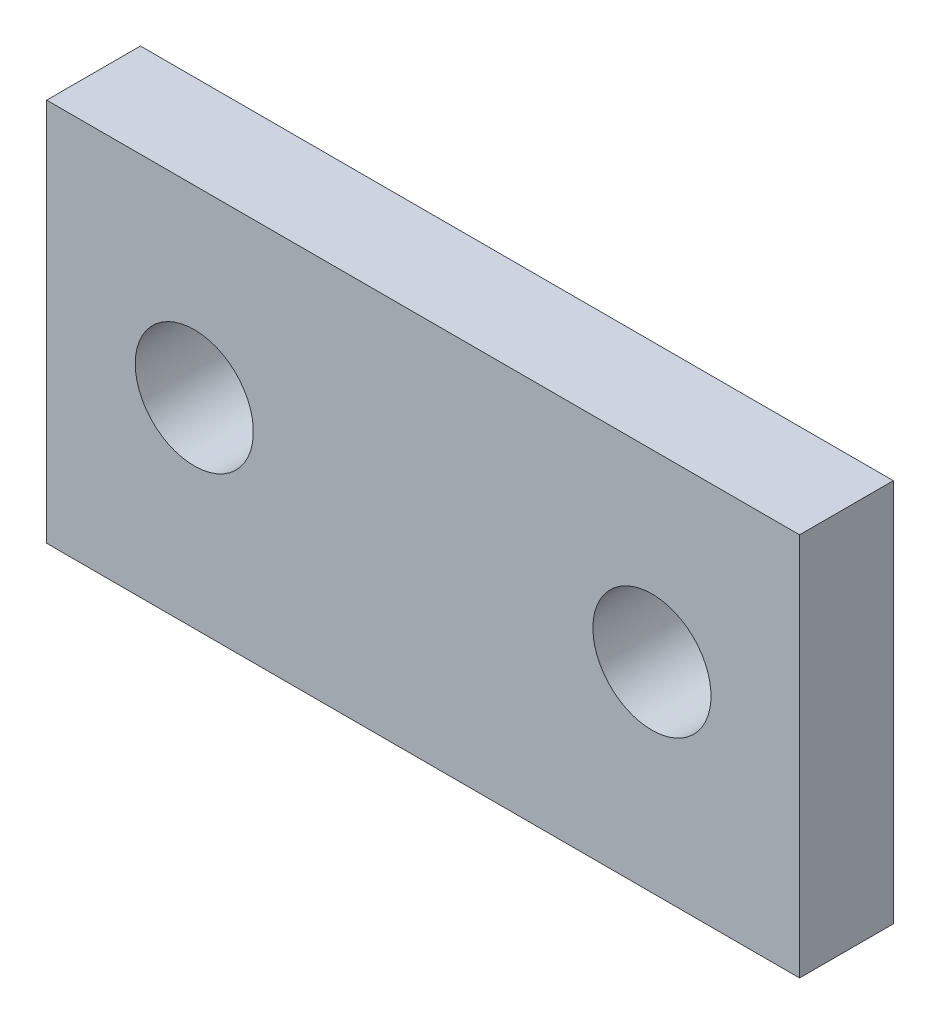
ISO-10303-21;
HEADER;
FILE_DESCRIPTION(('STEP AP214'),'2;1');
FILE_NAME('part.step','',(''),(''),'','','');
FILE_SCHEMA(('AUTOMOTIVE_DESIGN { 1 0 10303 214 1 1 1 1 }'));
ENDSEC;
DATA;
#1=APPLICATION_CONTEXT('core data for automotive mechanical design processes');
#2=APPLICATION_PROTOCOL_DEFINITION('international standard','automotive_design',2000,#1);
#3=PRODUCT_CONTEXT('',#1,'mechanical');
#4=PRODUCT('Part','Part','',(#3));
#5=PRODUCT_RELATED_PRODUCT_CATEGORY('part','',(#4));
#6=PRODUCT_DEFINITION_FORMATION('','',#4);
#7=PRODUCT_DEFINITION_CONTEXT('part definition',#1,'design');
#8=PRODUCT_DEFINITION('design','',#6,#7);
#9=PRODUCT_DEFINITION_SHAPE('','',#8);
#10=(LENGTH_UNIT() NAMED_UNIT(*) SI_UNIT(.MILLI.,.METRE.));
#11=(NAMED_UNIT(*) PLANE_ANGLE_UNIT() SI_UNIT($,.RADIAN.));
#12=(NAMED_UNIT(*) SI_UNIT($,.STERADIAN.) SOLID_ANGLE_UNIT());
#13=UNCERTAINTY_MEASURE_WITH_UNIT(LENGTH_MEASURE(1.E-05),#10,'distance_accuracy_value','');
#14=(GEOMETRIC_REPRESENTATION_CONTEXT(3) GLOBAL_UNCERTAINTY_ASSIGNED_CONTEXT((#13)) GLOBAL_UNIT_ASSIGNED_CONTEXT((#10,
#11,#12)) REPRESENTATION_CONTEXT('',''));
#15=CARTESIAN_POINT('',(0.,0.,0.));
#16=DIRECTION('',(0.,0.,1.));
#17=DIRECTION('',(1.,0.,0.));
#18=AXIS2_PLACEMENT_3D('',#15,#16,#17);
#19=CARTESIAN_POINT('',(-12.7407969924812,6.2308045112782,3.175));
#20=DIRECTION('',(1.,0.,0.));
#21=DIRECTION('',(0.,1.,0.));
#22=AXIS2_PLACEMENT_3D('',#19,#20,#21);
#23=PLANE('',#22);
#24=DIRECTION('',(0.,-1.,0.));
#25=VECTOR('',#24,1.);
#26=CARTESIAN_POINT('',(-12.7407969924812,6.2308045112782,0.));
#27=LINE('',#26,#25);
#28=CARTESIAN_POINT('',(-12.7407969924812,6.2308045112782,0.));
#29=VERTEX_POINT('',#28);
#30=CARTESIAN_POINT('',(-12.7407969924812,-6.7691954887218,0.));
#31=VERTEX_POINT('',#30);
#32=EDGE_CURVE('E97',#29,#31,#27,.T.);
#33=ORIENTED_EDGE('',*,*,#32,.T.);
#34=DIRECTION('',(0.,0.,-1.));
#35=VECTOR('',#34,1.);
#36=CARTESIAN_POINT('',(-12.7407969924812,-6.7691954887218,3.175));
#37=LINE('',#36,#35);
#38=CARTESIAN_POINT('',(-12.7407969924812,-6.7691954887218,3.175));
#39=VERTEX_POINT('',#38);
#40=EDGE_CURVE('E11',#39,#31,#37,.T.);
#41=ORIENTED_EDGE('',*,*,#40,.F.);
#42=DIRECTION('',(0.,-1.,0.));
#43=VECTOR('',#42,1.);
#44=CARTESIAN_POINT('',(-12.7407969924812,6.2308045112782,3.175));
#45=LINE('',#44,#43);
#46=CARTESIAN_POINT('',(-12.7407969924812,6.2308045112782,3.175));
#47=VERTEX_POINT('',#46);
#48=EDGE_CURVE('E85',#47,#39,#45,.T.);
#49=ORIENTED_EDGE('',*,*,#48,.F.);
#50=DIRECTION('',(0.,0.,-1.));
#51=VECTOR('',#50,1.);
#52=CARTESIAN_POINT('',(-12.7407969924812,6.2308045112782,3.175));
#53=LINE('',#52,#51);
#54=EDGE_CURVE('E93',#47,#29,#53,.T.);
#55=ORIENTED_EDGE('',*,*,#54,.T.);
#56=EDGE_LOOP('',(#33,#41,#49,#55));
#57=FACE_BOUND('',#56,.T.);
#58=ADVANCED_FACE('F34',(#57),#23,.F.);
#59=CARTESIAN_POINT('',(-12.7407969924812,-6.7691954887218,3.175));
#60=DIRECTION('',(0.,1.,0.));
#61=DIRECTION('',(0.,0.,1.));
#62=AXIS2_PLACEMENT_3D('',#59,#60,#61);
#63=PLANE('',#62);
#64=DIRECTION('',(1.,0.,0.));
#65=VECTOR('',#64,1.);
#66=CARTESIAN_POINT('',(-12.7407969924812,-6.7691954887218,0.));
#67=LINE('',#66,#65);
#68=CARTESIAN_POINT('',(12.7592030075188,-6.7691954887218,0.));
#69=VERTEX_POINT('',#68);
#70=EDGE_CURVE('E89',#31,#69,#67,.T.);
#71=ORIENTED_EDGE('',*,*,#70,.T.);
#72=DIRECTION('',(0.,0.,-1.));
#73=VECTOR('',#72,1.);
#74=CARTESIAN_POINT('',(12.7592030075188,-6.7691954887218,3.175));
#75=LINE('',#74,#73);
#76=CARTESIAN_POINT('',(12.7592030075188,-6.7691954887218,3.175));
#77=VERTEX_POINT('',#76);
#78=EDGE_CURVE('E42',#77,#69,#75,.T.);
#79=ORIENTED_EDGE('',*,*,#78,.F.);
#80=DIRECTION('',(1.,0.,0.));
#81=VECTOR('',#80,1.);
#82=CARTESIAN_POINT('',(-12.7407969924812,-6.7691954887218,3.175));
#83=LINE('',#82,#81);
#84=EDGE_CURVE('E80',#39,#77,#83,.T.);
#85=ORIENTED_EDGE('',*,*,#84,.F.);
#86=ORIENTED_EDGE('',*,*,#40,.T.);
#87=EDGE_LOOP('',(#71,#79,#85,#86));
#88=FACE_BOUND('',#87,.T.);
#89=ADVANCED_FACE('F88',(#88),#63,.F.);
#90=CARTESIAN_POINT('',(12.7592030075188,6.2308045112782,3.175));
#91=DIRECTION('',(-1.,0.,0.));
#92=DIRECTION('',(0.,-1.,0.));
#93=AXIS2_PLACEMENT_3D('',#90,#91,#92);
#94=PLANE('',#93);
#95=DIRECTION('',(0.,1.,0.));
#96=VECTOR('',#95,1.);
#97=CARTESIAN_POINT('',(12.7592030075188,6.2308045112782,0.));
#98=LINE('',#97,#96);
#99=CARTESIAN_POINT('',(12.7592030075188,6.2308045112782,0.));
#100=VERTEX_POINT('',#99);
#101=EDGE_CURVE('E67',#69,#100,#98,.T.);
#102=ORIENTED_EDGE('',*,*,#101,.T.);
#103=DIRECTION('',(0.,0.,-1.));
#104=VECTOR('',#103,1.);
#105=CARTESIAN_POINT('',(12.7592030075188,6.2308045112782,3.175));
#106=LINE('',#105,#104);
#107=CARTESIAN_POINT('',(12.7592030075188,6.2308045112782,3.175));
#108=VERTEX_POINT('',#107);
#109=EDGE_CURVE('E90',#108,#100,#106,.T.);
#110=ORIENTED_EDGE('',*,*,#109,.F.);
#111=DIRECTION('',(0.,1.,0.));
#112=VECTOR('',#111,1.);
#113=CARTESIAN_POINT('',(12.7592030075188,6.2308045112782,3.175));
#114=LINE('',#113,#112);
#115=EDGE_CURVE('E83',#77,#108,#114,.T.);
#116=ORIENTED_EDGE('',*,*,#115,.F.);
#117=ORIENTED_EDGE('',*,*,#78,.T.);
#118=EDGE_LOOP('',(#102,#110,#116,#117));
#119=FACE_BOUND('',#118,.T.);
#120=ADVANCED_FACE('F91',(#119),#94,.F.);
#121=CARTESIAN_POINT('',(-12.7407969924812,6.2308045112782,3.175));
#122=DIRECTION('',(0.,-1.,0.));
#123=DIRECTION('',(0.,0.,-1.));
#124=AXIS2_PLACEMENT_3D('',#121,#122,#123);
#125=PLANE('',#124);
#126=DIRECTION('',(-1.,0.,0.));
#127=VECTOR('',#126,1.);
#128=CARTESIAN_POINT('',(-12.7407969924812,6.2308045112782,0.));
#129=LINE('',#128,#127);
#130=EDGE_CURVE('E73',#100,#29,#129,.T.);
#131=ORIENTED_EDGE('',*,*,#130,.T.);
#132=ORIENTED_EDGE('',*,*,#54,.F.);
#133=DIRECTION('',(-1.,0.,0.));
#134=VECTOR('',#133,1.);
#135=CARTESIAN_POINT('',(-12.7407969924812,6.2308045112782,3.175));
#136=LINE('',#135,#134);
#137=EDGE_CURVE('E50',#108,#47,#136,.T.);
#138=ORIENTED_EDGE('',*,*,#137,.F.);
#139=ORIENTED_EDGE('',*,*,#109,.T.);
#140=EDGE_LOOP('',(#131,#132,#138,#139));
#141=FACE_BOUND('',#140,.T.);
#142=ADVANCED_FACE('F105',(#141),#125,.F.);
#143=CARTESIAN_POINT('',(0.,0.,3.175));
#144=DIRECTION('',(0.,0.,1.));
#145=DIRECTION('',(1.,0.,0.));
#146=AXIS2_PLACEMENT_3D('',#143,#144,#145);
#147=PLANE('',#146);
#148=CARTESIAN_POINT('',(7.75920300751881,0.,3.175));
#149=DIRECTION('',(0.,0.,-1.));
#150=DIRECTION('',(-1.,0.,0.));
#151=AXIS2_PLACEMENT_3D('',#148,#149,#150);
#152=CIRCLE('',#151,2.);
#153=CARTESIAN_POINT('',(5.75920300751881,0.,3.175));
#154=VERTEX_POINT('',#153);
#155=EDGE_CURVE('E100',#154,#154,#152,.T.);
#156=ORIENTED_EDGE('',*,*,#155,.T.);
#157=EDGE_LOOP('',(#156));
#158=FACE_BOUND('',#157,.T.);
#159=CARTESIAN_POINT('',(-7.74079699248119,0.,3.175));
#160=DIRECTION('',(0.,0.,-1.));
#161=DIRECTION('',(-1.,0.,0.));
#162=AXIS2_PLACEMENT_3D('',#159,#160,#161);
#163=CIRCLE('',#162,2.);
#164=CARTESIAN_POINT('',(-9.74079699248119,0.,3.175));
#165=VERTEX_POINT('',#164);
#166=EDGE_CURVE('E114',#165,#165,#163,.T.);
#167=ORIENTED_EDGE('',*,*,#166,.T.);
#168=EDGE_LOOP('',(#167));
#169=FACE_BOUND('',#168,.T.);
#170=ORIENTED_EDGE('',*,*,#48,.T.);
#171=ORIENTED_EDGE('',*,*,#84,.T.);
#172=ORIENTED_EDGE('',*,*,#115,.T.);
#173=ORIENTED_EDGE('',*,*,#137,.T.);
#174=EDGE_LOOP('',(#170,#171,#172,#173));
#175=FACE_BOUND('',#174,.T.);
#176=ADVANCED_FACE('F81',(#158,#169,#175),#147,.T.);
#177=CARTESIAN_POINT('',(0.,0.,0.));
#178=DIRECTION('',(0.,0.,1.));
#179=DIRECTION('',(1.,0.,0.));
#180=AXIS2_PLACEMENT_3D('',#177,#178,#179);
#181=PLANE('',#180);
#182=CARTESIAN_POINT('',(7.75920300751881,0.,0.));
#183=DIRECTION('',(0.,0.,-1.));
#184=DIRECTION('',(-1.,0.,0.));
#185=AXIS2_PLACEMENT_3D('',#182,#183,#184);
#186=CIRCLE('',#185,2.);
#187=CARTESIAN_POINT('',(5.75920300751881,0.,0.));
#188=VERTEX_POINT('',#187);
#189=EDGE_CURVE('E117',#188,#188,#186,.T.);
#190=ORIENTED_EDGE('',*,*,#189,.F.);
#191=EDGE_LOOP('',(#190));
#192=FACE_BOUND('',#191,.T.);
#193=CARTESIAN_POINT('',(-7.74079699248119,0.,0.));
#194=DIRECTION('',(0.,0.,-1.));
#195=DIRECTION('',(-1.,0.,0.));
#196=AXIS2_PLACEMENT_3D('',#193,#194,#195);
#197=CIRCLE('',#196,2.);
#198=CARTESIAN_POINT('',(-9.74079699248119,0.,0.));
#199=VERTEX_POINT('',#198);
#200=EDGE_CURVE('E111',#199,#199,#197,.T.);
#201=ORIENTED_EDGE('',*,*,#200,.F.);
#202=EDGE_LOOP('',(#201));
#203=FACE_BOUND('',#202,.T.);
#204=ORIENTED_EDGE('',*,*,#32,.F.);
#205=ORIENTED_EDGE('',*,*,#130,.F.);
#206=ORIENTED_EDGE('',*,*,#101,.F.);
#207=ORIENTED_EDGE('',*,*,#70,.F.);
#208=EDGE_LOOP('',(#204,#205,#206,#207));
#209=FACE_BOUND('',#208,.T.);
#210=ADVANCED_FACE('F108',(#192,#203,#209),#181,.F.);
#211=CARTESIAN_POINT('',(-7.74079699248119,0.,3.175));
#212=DIRECTION('',(0.,0.,-1.));
#213=DIRECTION('',(-1.,0.,0.));
#214=AXIS2_PLACEMENT_3D('',#211,#212,#213);
#215=CYLINDRICAL_SURFACE('',#214,2.);
#216=ORIENTED_EDGE('',*,*,#166,.F.);
#217=EDGE_LOOP('',(#216));
#218=FACE_BOUND('',#217,.T.);
#219=ORIENTED_EDGE('',*,*,#200,.T.);
#220=EDGE_LOOP('',(#219));
#221=FACE_BOUND('',#220,.T.);
#222=ADVANCED_FACE('F128',(#218,#221),#215,.F.);
#223=CARTESIAN_POINT('',(7.75920300751881,0.,3.175));
#224=DIRECTION('',(0.,0.,-1.));
#225=DIRECTION('',(-1.,0.,0.));
#226=AXIS2_PLACEMENT_3D('',#223,#224,#225);
#227=CYLINDRICAL_SURFACE('',#226,2.);
#228=ORIENTED_EDGE('',*,*,#155,.F.);
#229=EDGE_LOOP('',(#228));
#230=FACE_BOUND('',#229,.T.);
#231=ORIENTED_EDGE('',*,*,#189,.T.);
#232=EDGE_LOOP('',(#231));
#233=FACE_BOUND('',#232,.T.);
#234=ADVANCED_FACE('F125',(#230,#233),#227,.F.);
#235=CLOSED_SHELL('',(#58,#89,#120,#142,#176,#210,#222,#234));
#236=MANIFOLD_SOLID_BREP('B2',#235);
#237=ADVANCED_BREP_SHAPE_REPRESENTATION('',(#18,#236),#14);
#238=SHAPE_DEFINITION_REPRESENTATION(#9,#237);
ENDSEC;
END-ISO-10303-21;
